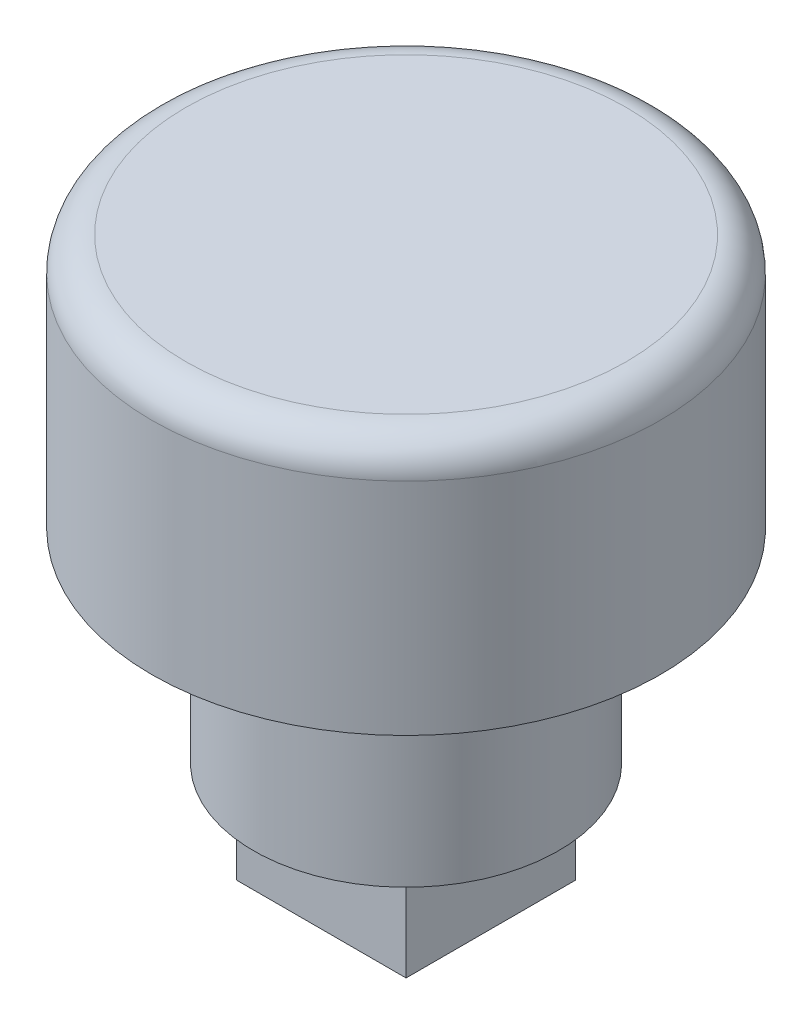
ISO-10303-21;
HEADER;
FILE_DESCRIPTION(('STEP AP214'),'2;1');
FILE_NAME('part.step','',(''),(''),'','','');
FILE_SCHEMA(('AUTOMOTIVE_DESIGN { 1 0 10303 214 1 1 1 1 }'));
ENDSEC;
DATA;
#1=APPLICATION_CONTEXT('core data for automotive mechanical design processes');
#2=APPLICATION_PROTOCOL_DEFINITION('international standard','automotive_design',2000,#1);
#3=PRODUCT_CONTEXT('',#1,'mechanical');
#4=PRODUCT('Part','Part','',(#3));
#5=PRODUCT_RELATED_PRODUCT_CATEGORY('part','',(#4));
#6=PRODUCT_DEFINITION_FORMATION('','',#4);
#7=PRODUCT_DEFINITION_CONTEXT('part definition',#1,'design');
#8=PRODUCT_DEFINITION('design','',#6,#7);
#9=PRODUCT_DEFINITION_SHAPE('','',#8);
#10=(LENGTH_UNIT() NAMED_UNIT(*) SI_UNIT(.MILLI.,.METRE.));
#11=(NAMED_UNIT(*) PLANE_ANGLE_UNIT() SI_UNIT($,.RADIAN.));
#12=(NAMED_UNIT(*) SI_UNIT($,.STERADIAN.) SOLID_ANGLE_UNIT());
#13=UNCERTAINTY_MEASURE_WITH_UNIT(LENGTH_MEASURE(1.E-05),#10,'distance_accuracy_value','');
#14=(GEOMETRIC_REPRESENTATION_CONTEXT(3) GLOBAL_UNCERTAINTY_ASSIGNED_CONTEXT((#13)) GLOBAL_UNIT_ASSIGNED_CONTEXT((#10,
#11,#12)) REPRESENTATION_CONTEXT('',''));
#15=CARTESIAN_POINT('',(0.,0.,0.));
#16=DIRECTION('',(0.,0.,1.));
#17=DIRECTION('',(1.,0.,0.));
#18=AXIS2_PLACEMENT_3D('',#15,#16,#17);
#19=CARTESIAN_POINT('',(0.,7.5,0.));
#20=DIRECTION('',(0.,-1.,0.));
#21=DIRECTION('',(0.,0.,-1.));
#22=AXIS2_PLACEMENT_3D('',#19,#20,#21);
#23=CYLINDRICAL_SURFACE('',#22,7.5);
#24=CARTESIAN_POINT('',(0.,6.5,0.));
#25=DIRECTION('',(0.,1.,0.));
#26=DIRECTION('',(0.,0.,1.));
#27=AXIS2_PLACEMENT_3D('',#24,#25,#26);
#28=CIRCLE('',#27,7.5);
#29=CARTESIAN_POINT('',(0.,6.5,7.5));
#30=VERTEX_POINT('',#29);
#31=EDGE_CURVE('E37',#30,#30,#28,.F.);
#32=ORIENTED_EDGE('',*,*,#31,.T.);
#33=EDGE_LOOP('',(#32));
#34=FACE_BOUND('',#33,.T.);
#35=CARTESIAN_POINT('',(0.,0.,0.));
#36=DIRECTION('',(0.,1.,0.));
#37=DIRECTION('',(0.,0.,1.));
#38=AXIS2_PLACEMENT_3D('',#35,#36,#37);
#39=CIRCLE('',#38,7.5);
#40=CARTESIAN_POINT('',(0.,0.,7.5));
#41=VERTEX_POINT('',#40);
#42=EDGE_CURVE('E98',#41,#41,#39,.T.);
#43=ORIENTED_EDGE('',*,*,#42,.T.);
#44=EDGE_LOOP('',(#43));
#45=FACE_BOUND('',#44,.T.);
#46=ADVANCED_FACE('F33',(#34,#45),#23,.T.);
#47=CARTESIAN_POINT('',(0.,7.5,0.));
#48=DIRECTION('',(0.,1.,0.));
#49=DIRECTION('',(0.,0.,1.));
#50=AXIS2_PLACEMENT_3D('',#47,#48,#49);
#51=PLANE('',#50);
#52=CARTESIAN_POINT('',(0.,7.5,0.));
#53=DIRECTION('',(0.,1.,0.));
#54=DIRECTION('',(0.,0.,1.));
#55=AXIS2_PLACEMENT_3D('',#52,#53,#54);
#56=CIRCLE('',#55,6.5);
#57=CARTESIAN_POINT('',(0.,7.5,6.5));
#58=VERTEX_POINT('',#57);
#59=EDGE_CURVE('E105',#58,#58,#56,.T.);
#60=ORIENTED_EDGE('',*,*,#59,.T.);
#61=EDGE_LOOP('',(#60));
#62=FACE_BOUND('',#61,.T.);
#63=ADVANCED_FACE('F125',(#62),#51,.T.);
#64=CARTESIAN_POINT('',(0.,0.,0.));
#65=DIRECTION('',(0.,1.,0.));
#66=DIRECTION('',(0.,0.,1.));
#67=AXIS2_PLACEMENT_3D('',#64,#65,#66);
#68=PLANE('',#67);
#69=CARTESIAN_POINT('',(0.,0.,0.));
#70=DIRECTION('',(0.,-1.,0.));
#71=DIRECTION('',(0.,0.,-1.));
#72=AXIS2_PLACEMENT_3D('',#69,#70,#71);
#73=CIRCLE('',#72,4.5);
#74=CARTESIAN_POINT('',(0.,0.,-4.5));
#75=VERTEX_POINT('',#74);
#76=EDGE_CURVE('E11',#75,#75,#73,.T.);
#77=ORIENTED_EDGE('',*,*,#76,.F.);
#78=EDGE_LOOP('',(#77));
#79=FACE_BOUND('',#78,.T.);
#80=ORIENTED_EDGE('',*,*,#42,.F.);
#81=EDGE_LOOP('',(#80));
#82=FACE_BOUND('',#81,.T.);
#83=ADVANCED_FACE('F117',(#79,#82),#68,.F.);
#84=CARTESIAN_POINT('',(0.,6.5,0.));
#85=DIRECTION('',(0.,1.,0.));
#86=DIRECTION('',(0.,0.,1.));
#87=AXIS2_PLACEMENT_3D('',#84,#85,#86);
#88=TOROIDAL_SURFACE('',#87,6.5,1.);
#89=ORIENTED_EDGE('',*,*,#31,.F.);
#90=EDGE_LOOP('',(#89));
#91=FACE_BOUND('',#90,.T.);
#92=ORIENTED_EDGE('',*,*,#59,.F.);
#93=EDGE_LOOP('',(#92));
#94=FACE_BOUND('',#93,.T.);
#95=ADVANCED_FACE('F35',(#91,#94),#88,.T.);
#96=CARTESIAN_POINT('',(0.,-6.,0.));
#97=DIRECTION('',(0.,1.,0.));
#98=DIRECTION('',(0.,0.,1.));
#99=AXIS2_PLACEMENT_3D('',#96,#97,#98);
#100=CYLINDRICAL_SURFACE('',#99,4.5);
#101=CARTESIAN_POINT('',(0.,-6.,0.));
#102=DIRECTION('',(0.,-1.,0.));
#103=DIRECTION('',(0.,0.,-1.));
#104=AXIS2_PLACEMENT_3D('',#101,#102,#103);
#105=CIRCLE('',#104,4.5);
#106=CARTESIAN_POINT('',(0.,-6.,-4.5));
#107=VERTEX_POINT('',#106);
#108=EDGE_CURVE('E95',#107,#107,#105,.T.);
#109=ORIENTED_EDGE('',*,*,#108,.F.);
#110=EDGE_LOOP('',(#109));
#111=FACE_BOUND('',#110,.T.);
#112=ORIENTED_EDGE('',*,*,#76,.T.);
#113=EDGE_LOOP('',(#112));
#114=FACE_BOUND('',#113,.T.);
#115=ADVANCED_FACE('F116',(#111,#114),#100,.T.);
#116=CARTESIAN_POINT('',(0.,-6.,0.));
#117=DIRECTION('',(0.,-1.,0.));
#118=DIRECTION('',(0.,0.,-1.));
#119=AXIS2_PLACEMENT_3D('',#116,#117,#118);
#120=PLANE('',#119);
#121=DIRECTION('',(0.,0.,-1.));
#122=VECTOR('',#121,1.);
#123=CARTESIAN_POINT('',(-2.5,-6.,-2.5));
#124=LINE('',#123,#122);
#125=CARTESIAN_POINT('',(-2.5,-6.,2.5));
#126=VERTEX_POINT('',#125);
#127=CARTESIAN_POINT('',(-2.5,-6.,-2.5));
#128=VERTEX_POINT('',#127);
#129=EDGE_CURVE('E49',#126,#128,#124,.T.);
#130=ORIENTED_EDGE('',*,*,#129,.F.);
#131=DIRECTION('',(-1.,0.,0.));
#132=VECTOR('',#131,1.);
#133=CARTESIAN_POINT('',(2.5,-6.,2.5));
#134=LINE('',#133,#132);
#135=CARTESIAN_POINT('',(2.5,-6.,2.5));
#136=VERTEX_POINT('',#135);
#137=EDGE_CURVE('E53',#136,#126,#134,.T.);
#138=ORIENTED_EDGE('',*,*,#137,.F.);
#139=DIRECTION('',(0.,0.,1.));
#140=VECTOR('',#139,1.);
#141=CARTESIAN_POINT('',(2.5,-6.,-2.5));
#142=LINE('',#141,#140);
#143=CARTESIAN_POINT('',(2.5,-6.,-2.5));
#144=VERTEX_POINT('',#143);
#145=EDGE_CURVE('E214',#144,#136,#142,.T.);
#146=ORIENTED_EDGE('',*,*,#145,.F.);
#147=DIRECTION('',(1.,0.,0.));
#148=VECTOR('',#147,1.);
#149=CARTESIAN_POINT('',(2.5,-6.,-2.5));
#150=LINE('',#149,#148);
#151=EDGE_CURVE('E220',#128,#144,#150,.T.);
#152=ORIENTED_EDGE('',*,*,#151,.F.);
#153=EDGE_LOOP('',(#130,#138,#146,#152));
#154=FACE_BOUND('',#153,.T.);
#155=ORIENTED_EDGE('',*,*,#108,.T.);
#156=EDGE_LOOP('',(#155));
#157=FACE_BOUND('',#156,.T.);
#158=ADVANCED_FACE('F122',(#154,#157),#120,.T.);
#159=CARTESIAN_POINT('',(-2.5,-9.,-2.5));
#160=DIRECTION('',(1.,0.,0.));
#161=DIRECTION('',(0.,0.,-1.));
#162=AXIS2_PLACEMENT_3D('',#159,#160,#161);
#163=PLANE('',#162);
#164=ORIENTED_EDGE('',*,*,#129,.T.);
#165=DIRECTION('',(0.,1.,0.));
#166=VECTOR('',#165,1.);
#167=CARTESIAN_POINT('',(-2.5,-9.,-2.5));
#168=LINE('',#167,#166);
#169=CARTESIAN_POINT('',(-2.5,-9.,-2.5));
#170=VERTEX_POINT('',#169);
#171=EDGE_CURVE('E78',#170,#128,#168,.T.);
#172=ORIENTED_EDGE('',*,*,#171,.F.);
#173=DIRECTION('',(0.,0.,-1.));
#174=VECTOR('',#173,1.);
#175=CARTESIAN_POINT('',(-2.5,-9.,-2.5));
#176=LINE('',#175,#174);
#177=CARTESIAN_POINT('',(-2.5,-9.,2.5));
#178=VERTEX_POINT('',#177);
#179=EDGE_CURVE('E84',#178,#170,#176,.T.);
#180=ORIENTED_EDGE('',*,*,#179,.F.);
#181=DIRECTION('',(0.,1.,0.));
#182=VECTOR('',#181,1.);
#183=CARTESIAN_POINT('',(-2.5,-9.,2.5));
#184=LINE('',#183,#182);
#185=EDGE_CURVE('E212',#178,#126,#184,.T.);
#186=ORIENTED_EDGE('',*,*,#185,.T.);
#187=EDGE_LOOP('',(#164,#172,#180,#186));
#188=FACE_BOUND('',#187,.T.);
#189=ADVANCED_FACE('F94',(#188),#163,.F.);
#190=CARTESIAN_POINT('',(2.5,-9.,-2.5));
#191=DIRECTION('',(0.,0.,1.));
#192=DIRECTION('',(1.,0.,0.));
#193=AXIS2_PLACEMENT_3D('',#190,#191,#192);
#194=PLANE('',#193);
#195=ORIENTED_EDGE('',*,*,#151,.T.);
#196=DIRECTION('',(0.,1.,0.));
#197=VECTOR('',#196,1.);
#198=CARTESIAN_POINT('',(2.5,-9.,-2.5));
#199=LINE('',#198,#197);
#200=CARTESIAN_POINT('',(2.5,-9.,-2.5));
#201=VERTEX_POINT('',#200);
#202=EDGE_CURVE('E80',#201,#144,#199,.T.);
#203=ORIENTED_EDGE('',*,*,#202,.F.);
#204=DIRECTION('',(1.,0.,0.));
#205=VECTOR('',#204,1.);
#206=CARTESIAN_POINT('',(2.5,-9.,-2.5));
#207=LINE('',#206,#205);
#208=EDGE_CURVE('E73',#170,#201,#207,.T.);
#209=ORIENTED_EDGE('',*,*,#208,.F.);
#210=ORIENTED_EDGE('',*,*,#171,.T.);
#211=EDGE_LOOP('',(#195,#203,#209,#210));
#212=FACE_BOUND('',#211,.T.);
#213=ADVANCED_FACE('F76',(#212),#194,.F.);
#214=CARTESIAN_POINT('',(2.5,-9.,-2.5));
#215=DIRECTION('',(-1.,0.,0.));
#216=DIRECTION('',(0.,0.,1.));
#217=AXIS2_PLACEMENT_3D('',#214,#215,#216);
#218=PLANE('',#217);
#219=ORIENTED_EDGE('',*,*,#145,.T.);
#220=DIRECTION('',(0.,1.,0.));
#221=VECTOR('',#220,1.);
#222=CARTESIAN_POINT('',(2.5,-9.,2.5));
#223=LINE('',#222,#221);
#224=CARTESIAN_POINT('',(2.5,-9.,2.5));
#225=VERTEX_POINT('',#224);
#226=EDGE_CURVE('E100',#225,#136,#223,.T.);
#227=ORIENTED_EDGE('',*,*,#226,.F.);
#228=DIRECTION('',(0.,0.,1.));
#229=VECTOR('',#228,1.);
#230=CARTESIAN_POINT('',(2.5,-9.,-2.5));
#231=LINE('',#230,#229);
#232=EDGE_CURVE('E83',#201,#225,#231,.T.);
#233=ORIENTED_EDGE('',*,*,#232,.F.);
#234=ORIENTED_EDGE('',*,*,#202,.T.);
#235=EDGE_LOOP('',(#219,#227,#233,#234));
#236=FACE_BOUND('',#235,.T.);
#237=ADVANCED_FACE('F140',(#236),#218,.F.);
#238=CARTESIAN_POINT('',(2.5,-9.,2.5));
#239=DIRECTION('',(0.,0.,-1.));
#240=DIRECTION('',(-1.,0.,0.));
#241=AXIS2_PLACEMENT_3D('',#238,#239,#240);
#242=PLANE('',#241);
#243=ORIENTED_EDGE('',*,*,#137,.T.);
#244=ORIENTED_EDGE('',*,*,#185,.F.);
#245=DIRECTION('',(-1.,0.,0.));
#246=VECTOR('',#245,1.);
#247=CARTESIAN_POINT('',(2.5,-9.,2.5));
#248=LINE('',#247,#246);
#249=EDGE_CURVE('E89',#225,#178,#248,.T.);
#250=ORIENTED_EDGE('',*,*,#249,.F.);
#251=ORIENTED_EDGE('',*,*,#226,.T.);
#252=EDGE_LOOP('',(#243,#244,#250,#251));
#253=FACE_BOUND('',#252,.T.);
#254=ADVANCED_FACE('F143',(#253),#242,.F.);
#255=CARTESIAN_POINT('',(0.,-9.,0.));
#256=DIRECTION('',(0.,-1.,0.));
#257=DIRECTION('',(0.,0.,-1.));
#258=AXIS2_PLACEMENT_3D('',#255,#256,#257);
#259=PLANE('',#258);
#260=ORIENTED_EDGE('',*,*,#179,.T.);
#261=ORIENTED_EDGE('',*,*,#208,.T.);
#262=ORIENTED_EDGE('',*,*,#232,.T.);
#263=ORIENTED_EDGE('',*,*,#249,.T.);
#264=EDGE_LOOP('',(#260,#261,#262,#263));
#265=FACE_BOUND('',#264,.T.);
#266=ADVANCED_FACE('F87',(#265),#259,.T.);
#267=CLOSED_SHELL('',(#46,#63,#83,#95,#115,#158,#189,#213,#237,#254,#266));
#268=MANIFOLD_SOLID_BREP('B2',#267);
#269=ADVANCED_BREP_SHAPE_REPRESENTATION('',(#18,#268),#14);
#270=SHAPE_DEFINITION_REPRESENTATION(#9,#269);
ENDSEC;
END-ISO-10303-21;
